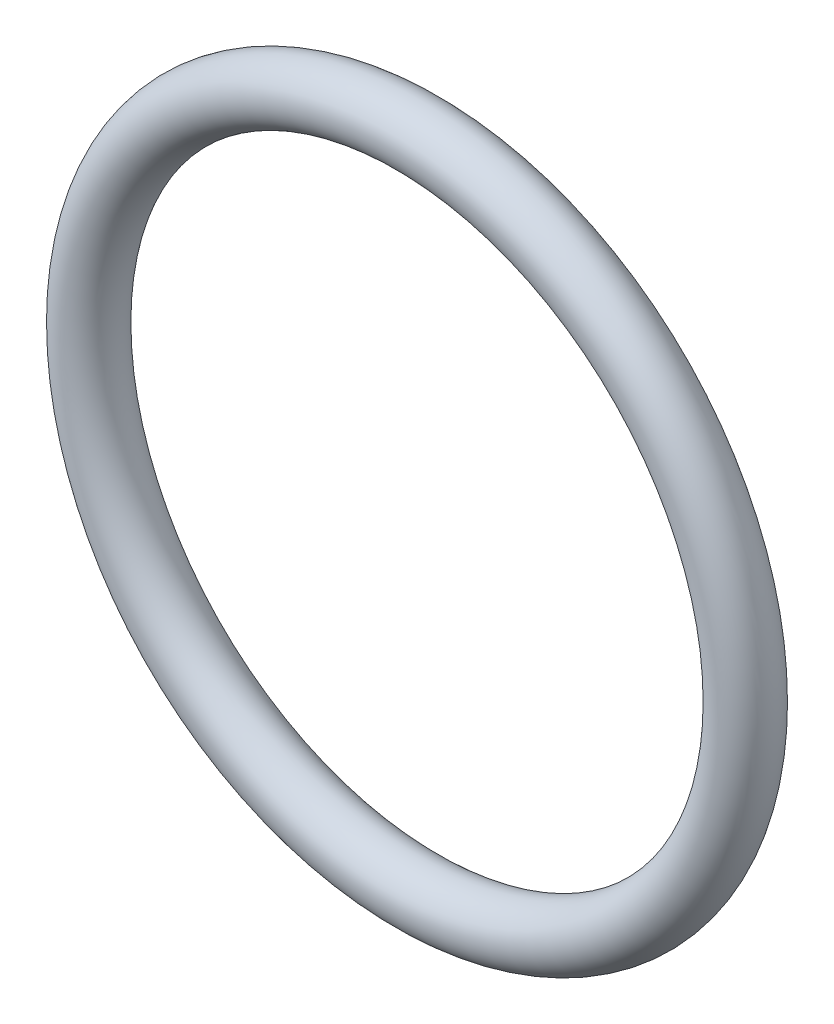
ISO-10303-21;
HEADER;
FILE_DESCRIPTION(('STEP AP214'),'2;1');
FILE_NAME('part.step','',(''),(''),'','','');
FILE_SCHEMA(('AUTOMOTIVE_DESIGN { 1 0 10303 214 1 1 1 1 }'));
ENDSEC;
DATA;
#1=APPLICATION_CONTEXT('core data for automotive mechanical design processes');
#2=APPLICATION_PROTOCOL_DEFINITION('international standard','automotive_design',2000,#1);
#3=PRODUCT_CONTEXT('',#1,'mechanical');
#4=PRODUCT('Part','Part','',(#3));
#5=PRODUCT_RELATED_PRODUCT_CATEGORY('part','',(#4));
#6=PRODUCT_DEFINITION_FORMATION('','',#4);
#7=PRODUCT_DEFINITION_CONTEXT('part definition',#1,'design');
#8=PRODUCT_DEFINITION('design','',#6,#7);
#9=PRODUCT_DEFINITION_SHAPE('','',#8);
#10=(LENGTH_UNIT() NAMED_UNIT(*) SI_UNIT(.MILLI.,.METRE.));
#11=(NAMED_UNIT(*) PLANE_ANGLE_UNIT() SI_UNIT($,.RADIAN.));
#12=(NAMED_UNIT(*) SI_UNIT($,.STERADIAN.) SOLID_ANGLE_UNIT());
#13=UNCERTAINTY_MEASURE_WITH_UNIT(LENGTH_MEASURE(1.E-05),#10,'distance_accuracy_value','');
#14=(GEOMETRIC_REPRESENTATION_CONTEXT(3) GLOBAL_UNCERTAINTY_ASSIGNED_CONTEXT((#13)) GLOBAL_UNIT_ASSIGNED_CONTEXT((#10,
#11,#12)) REPRESENTATION_CONTEXT('',''));
#15=CARTESIAN_POINT('',(0.,0.,0.));
#16=DIRECTION('',(0.,0.,1.));
#17=DIRECTION('',(1.,0.,0.));
#18=AXIS2_PLACEMENT_3D('',#15,#16,#17);
#19=CARTESIAN_POINT('',(0.,0.,0.));
#20=DIRECTION('',(0.,0.,1.));
#21=DIRECTION('',(1.,0.,0.));
#22=AXIS2_PLACEMENT_3D('',#19,#20,#21);
#23=TOROIDAL_SURFACE('',#22,29.337,2.667);
#24=CARTESIAN_POINT('',(32.004,0.,0.));
#25=VERTEX_POINT('',#24);
#26=VERTEX_LOOP('',#25);
#27=FACE_BOUND('',#26,.T.);
#28=ADVANCED_FACE('F13',(#27),#23,.T.);
#29=CLOSED_SHELL('',(#28));
#30=MANIFOLD_SOLID_BREP('B1',#29);
#31=ADVANCED_BREP_SHAPE_REPRESENTATION('',(#18,#30),#14);
#32=SHAPE_DEFINITION_REPRESENTATION(#9,#31);
ENDSEC;
END-ISO-10303-21;
